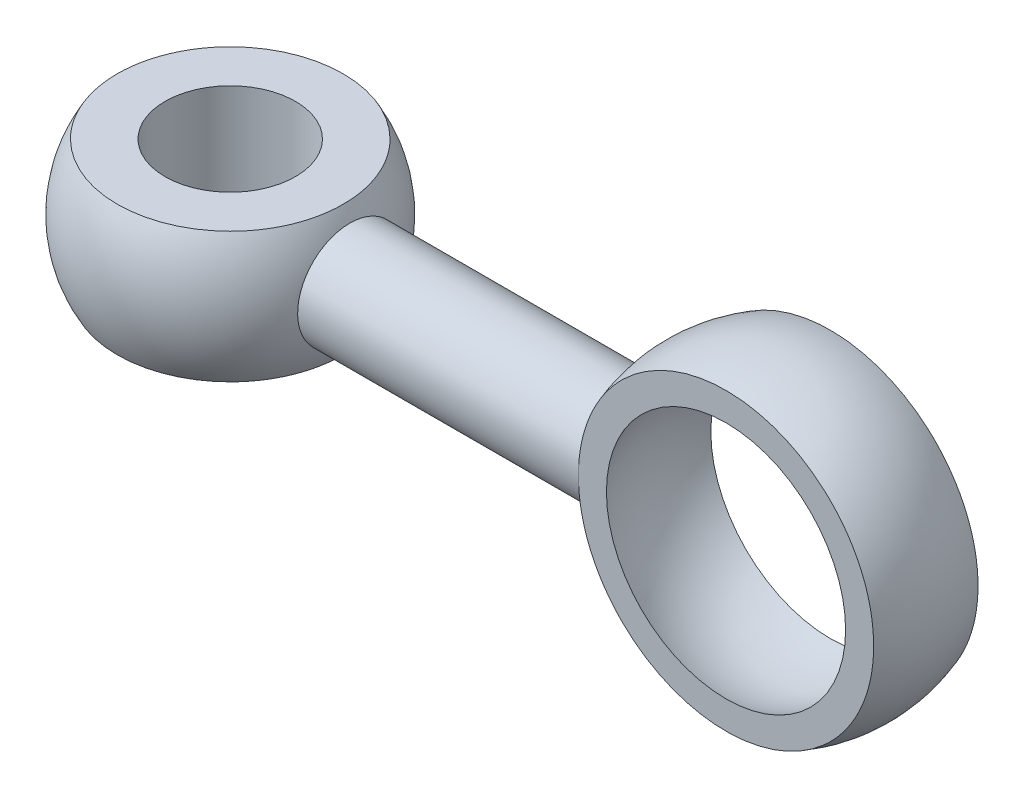
ISO-10303-21;
HEADER;
FILE_DESCRIPTION(('STEP AP214'),'2;1');
FILE_NAME('part.step','',(''),(''),'','','');
FILE_SCHEMA(('AUTOMOTIVE_DESIGN { 1 0 10303 214 1 1 1 1 }'));
ENDSEC;
DATA;
#1=APPLICATION_CONTEXT('core data for automotive mechanical design processes');
#2=APPLICATION_PROTOCOL_DEFINITION('international standard','automotive_design',2000,#1);
#3=PRODUCT_CONTEXT('',#1,'mechanical');
#4=PRODUCT('Part','Part','',(#3));
#5=PRODUCT_RELATED_PRODUCT_CATEGORY('part','',(#4));
#6=PRODUCT_DEFINITION_FORMATION('','',#4);
#7=PRODUCT_DEFINITION_CONTEXT('part definition',#1,'design');
#8=PRODUCT_DEFINITION('design','',#6,#7);
#9=PRODUCT_DEFINITION_SHAPE('','',#8);
#10=(LENGTH_UNIT() NAMED_UNIT(*) SI_UNIT(.MILLI.,.METRE.));
#11=(NAMED_UNIT(*) PLANE_ANGLE_UNIT() SI_UNIT($,.RADIAN.));
#12=(NAMED_UNIT(*) SI_UNIT($,.STERADIAN.) SOLID_ANGLE_UNIT());
#13=UNCERTAINTY_MEASURE_WITH_UNIT(LENGTH_MEASURE(1.E-05),#10,'distance_accuracy_value','');
#14=(GEOMETRIC_REPRESENTATION_CONTEXT(3) GLOBAL_UNCERTAINTY_ASSIGNED_CONTEXT((#13)) GLOBAL_UNIT_ASSIGNED_CONTEXT((#10,
#11,#12)) REPRESENTATION_CONTEXT('',''));
#15=CARTESIAN_POINT('',(0.,0.,0.));
#16=DIRECTION('',(0.,0.,1.));
#17=DIRECTION('',(1.,0.,0.));
#18=AXIS2_PLACEMENT_3D('',#15,#16,#17);
#19=CARTESIAN_POINT('',(0.,0.,0.));
#20=DIRECTION('',(1.,0.,0.));
#21=DIRECTION('',(0.,-1.,0.));
#22=AXIS2_PLACEMENT_3D('',#19,#20,#21);
#23=SPHERICAL_SURFACE('',#22,6.);
#24=CARTESIAN_POINT('',(-5.65685424949238,0.,0.));
#25=DIRECTION('',(1.,0.,0.));
#26=DIRECTION('',(0.,0.,-1.));
#27=AXIS2_PLACEMENT_3D('',#24,#25,#26);
#28=CIRCLE('',#27,2.);
#29=CARTESIAN_POINT('',(-5.65685424949238,0.,2.));
#30=VERTEX_POINT('',#29);
#31=CARTESIAN_POINT('',(-5.65685424949238,0.,-2.));
#32=VERTEX_POINT('',#31);
#33=EDGE_CURVE('E58',#30,#32,#28,.T.);
#34=ORIENTED_EDGE('',*,*,#33,.T.);
#35=CARTESIAN_POINT('',(0.,0.,-2.));
#36=DIRECTION('',(0.,0.,1.));
#37=DIRECTION('',(1.,0.,0.));
#38=AXIS2_PLACEMENT_3D('',#35,#36,#37);
#39=CIRCLE('',#38,5.65685424949238);
#40=EDGE_CURVE('E11',#32,#32,#39,.F.);
#41=ORIENTED_EDGE('',*,*,#40,.F.);
#42=EDGE_CURVE('E60',#32,#30,#28,.T.);
#43=ORIENTED_EDGE('',*,*,#42,.T.);
#44=CARTESIAN_POINT('',(0.,0.,2.));
#45=DIRECTION('',(0.,0.,-1.));
#46=DIRECTION('',(-1.,0.,0.));
#47=AXIS2_PLACEMENT_3D('',#44,#45,#46);
#48=CIRCLE('',#47,5.65685424949238);
#49=EDGE_CURVE('E48',#30,#30,#48,.F.);
#50=ORIENTED_EDGE('',*,*,#49,.F.);
#51=EDGE_LOOP('',(#34,#41,#43,#50));
#52=FACE_BOUND('',#51,.T.);
#53=ADVANCED_FACE('F39',(#52),#23,.T.);
#54=CARTESIAN_POINT('',(-21.,0.,0.));
#55=DIRECTION('',(1.,0.,0.));
#56=DIRECTION('',(0.,1.,0.));
#57=AXIS2_PLACEMENT_3D('',#54,#55,#56);
#58=SPHERICAL_SURFACE('',#57,5.);
#59=CARTESIAN_POINT('',(-21.,-2.5,0.));
#60=DIRECTION('',(0.,1.,0.));
#61=DIRECTION('',(0.,0.,1.));
#62=AXIS2_PLACEMENT_3D('',#59,#60,#61);
#63=CIRCLE('',#62,4.33012701892219);
#64=CARTESIAN_POINT('',(-21.,-2.5,4.33012701892219));
#65=VERTEX_POINT('',#64);
#66=EDGE_CURVE('E63',#65,#65,#63,.F.);
#67=ORIENTED_EDGE('',*,*,#66,.F.);
#68=EDGE_LOOP('',(#67));
#69=FACE_BOUND('',#68,.T.);
#70=CARTESIAN_POINT('',(-21.,2.5,0.));
#71=DIRECTION('',(0.,-1.,0.));
#72=DIRECTION('',(0.,0.,-1.));
#73=AXIS2_PLACEMENT_3D('',#70,#71,#72);
#74=CIRCLE('',#73,4.33012701892219);
#75=CARTESIAN_POINT('',(-21.,2.5,-4.33012701892219));
#76=VERTEX_POINT('',#75);
#77=EDGE_CURVE('E67',#76,#76,#74,.F.);
#78=ORIENTED_EDGE('',*,*,#77,.F.);
#79=EDGE_LOOP('',(#78));
#80=FACE_BOUND('',#79,.T.);
#81=CARTESIAN_POINT('',(-16.4174243050442,0.,0.));
#82=DIRECTION('',(1.,0.,0.));
#83=DIRECTION('',(0.,0.,-1.));
#84=AXIS2_PLACEMENT_3D('',#81,#82,#83);
#85=CIRCLE('',#84,2.);
#86=CARTESIAN_POINT('',(-16.4174243050442,0.,-2.));
#87=VERTEX_POINT('',#86);
#88=EDGE_CURVE('E78',#87,#87,#85,.T.);
#89=ORIENTED_EDGE('',*,*,#88,.F.);
#90=EDGE_LOOP('',(#89));
#91=FACE_BOUND('',#90,.T.);
#92=ADVANCED_FACE('F108',(#69,#80,#91),#58,.T.);
#93=CARTESIAN_POINT('',(6.21465699734194,0.,0.));
#94=DIRECTION('',(1.,0.,0.));
#95=DIRECTION('',(0.,0.,-1.));
#96=AXIS2_PLACEMENT_3D('',#93,#94,#95);
#97=CYLINDRICAL_SURFACE('',#96,2.);
#98=ORIENTED_EDGE('',*,*,#88,.T.);
#99=EDGE_LOOP('',(#98));
#100=FACE_BOUND('',#99,.T.);
#101=ORIENTED_EDGE('',*,*,#42,.F.);
#102=ORIENTED_EDGE('',*,*,#33,.F.);
#103=EDGE_LOOP('',(#101,#102));
#104=FACE_BOUND('',#103,.T.);
#105=ADVANCED_FACE('F112',(#100,#104),#97,.T.);
#106=CARTESIAN_POINT('',(-16.6698729810778,2.5,-5.));
#107=DIRECTION('',(0.,-1.,0.));
#108=DIRECTION('',(0.,0.,-1.));
#109=AXIS2_PLACEMENT_3D('',#106,#107,#108);
#110=PLANE('',#109);
#111=CARTESIAN_POINT('',(-21.,2.5,0.));
#112=DIRECTION('',(0.,1.,0.));
#113=DIRECTION('',(0.,0.,1.));
#114=AXIS2_PLACEMENT_3D('',#111,#112,#113);
#115=CIRCLE('',#114,2.5);
#116=CARTESIAN_POINT('',(-21.,2.5,2.5));
#117=VERTEX_POINT('',#116);
#118=EDGE_CURVE('E73',#117,#117,#115,.T.);
#119=ORIENTED_EDGE('',*,*,#118,.F.);
#120=EDGE_LOOP('',(#119));
#121=FACE_BOUND('',#120,.T.);
#122=ORIENTED_EDGE('',*,*,#77,.T.);
#123=EDGE_LOOP('',(#122));
#124=FACE_BOUND('',#123,.T.);
#125=ADVANCED_FACE('F117',(#121,#124),#110,.F.);
#126=CARTESIAN_POINT('',(-16.6698729810778,-2.5,-5.));
#127=DIRECTION('',(0.,1.,0.));
#128=DIRECTION('',(0.,0.,1.));
#129=AXIS2_PLACEMENT_3D('',#126,#127,#128);
#130=PLANE('',#129);
#131=CARTESIAN_POINT('',(-21.,-2.5,0.));
#132=DIRECTION('',(0.,1.,0.));
#133=DIRECTION('',(0.,0.,1.));
#134=AXIS2_PLACEMENT_3D('',#131,#132,#133);
#135=CIRCLE('',#134,2.5);
#136=CARTESIAN_POINT('',(-21.,-2.5,2.5));
#137=VERTEX_POINT('',#136);
#138=EDGE_CURVE('E70',#137,#137,#135,.T.);
#139=ORIENTED_EDGE('',*,*,#138,.T.);
#140=EDGE_LOOP('',(#139));
#141=FACE_BOUND('',#140,.T.);
#142=ORIENTED_EDGE('',*,*,#66,.T.);
#143=EDGE_LOOP('',(#142));
#144=FACE_BOUND('',#143,.T.);
#145=ADVANCED_FACE('F125',(#141,#144),#130,.F.);
#146=CARTESIAN_POINT('',(-21.,-7.5,0.));
#147=DIRECTION('',(0.,1.,0.));
#148=DIRECTION('',(0.,0.,1.));
#149=AXIS2_PLACEMENT_3D('',#146,#147,#148);
#150=CYLINDRICAL_SURFACE('',#149,2.5);
#151=ORIENTED_EDGE('',*,*,#118,.T.);
#152=EDGE_LOOP('',(#151));
#153=FACE_BOUND('',#152,.T.);
#154=ORIENTED_EDGE('',*,*,#138,.F.);
#155=EDGE_LOOP('',(#154));
#156=FACE_BOUND('',#155,.T.);
#157=ADVANCED_FACE('F129',(#153,#156),#150,.F.);
#158=CARTESIAN_POINT('',(-5.65685424949238,-6.,2.));
#159=DIRECTION('',(0.,0.,-1.));
#160=DIRECTION('',(-1.,0.,0.));
#161=AXIS2_PLACEMENT_3D('',#158,#159,#160);
#162=PLANE('',#161);
#163=CARTESIAN_POINT('',(0.,0.,2.));
#164=DIRECTION('',(0.,0.,-1.));
#165=DIRECTION('',(-1.,0.,0.));
#166=AXIS2_PLACEMENT_3D('',#163,#164,#165);
#167=CIRCLE('',#166,4.58257569495584);
#168=CARTESIAN_POINT('',(-4.58257569495584,0.,2.));
#169=VERTEX_POINT('',#168);
#170=EDGE_CURVE('E87',#169,#169,#167,.T.);
#171=ORIENTED_EDGE('',*,*,#170,.T.);
#172=EDGE_LOOP('',(#171));
#173=FACE_BOUND('',#172,.T.);
#174=ORIENTED_EDGE('',*,*,#49,.T.);
#175=EDGE_LOOP('',(#174));
#176=FACE_BOUND('',#175,.T.);
#177=ADVANCED_FACE('F105',(#173,#176),#162,.F.);
#178=CARTESIAN_POINT('',(-5.65685424949238,-6.,-2.00000000000001));
#179=DIRECTION('',(0.,0.,1.));
#180=DIRECTION('',(1.,0.,0.));
#181=AXIS2_PLACEMENT_3D('',#178,#179,#180);
#182=PLANE('',#181);
#183=CARTESIAN_POINT('',(0.,0.,-2.));
#184=DIRECTION('',(0.,0.,1.));
#185=DIRECTION('',(1.,0.,0.));
#186=AXIS2_PLACEMENT_3D('',#183,#184,#185);
#187=CIRCLE('',#186,4.58257569495584);
#188=CARTESIAN_POINT('',(4.58257569495584,0.,-2.));
#189=VERTEX_POINT('',#188);
#190=EDGE_CURVE('E42',#189,#189,#187,.T.);
#191=ORIENTED_EDGE('',*,*,#190,.T.);
#192=EDGE_LOOP('',(#191));
#193=FACE_BOUND('',#192,.T.);
#194=ORIENTED_EDGE('',*,*,#40,.T.);
#195=EDGE_LOOP('',(#194));
#196=FACE_BOUND('',#195,.T.);
#197=ADVANCED_FACE('F96',(#193,#196),#182,.F.);
#198=CARTESIAN_POINT('',(0.,0.,0.));
#199=DIRECTION('',(0.,1.,0.));
#200=DIRECTION('',(1.,0.,0.));
#201=AXIS2_PLACEMENT_3D('',#198,#199,#200);
#202=SPHERICAL_SURFACE('',#201,5.);
#203=CARTESIAN_POINT('',(0.,0.,0.));
#204=DIRECTION('',(0.,0.,1.));
#205=DIRECTION('',(1.,0.,0.));
#206=AXIS2_PLACEMENT_3D('',#203,#204,#205);
#207=SPHERICAL_SURFACE('',#206,5.);
#208=ORIENTED_EDGE('',*,*,#190,.F.);
#209=EDGE_LOOP('',(#208));
#210=FACE_BOUND('',#209,.T.);
#211=ORIENTED_EDGE('',*,*,#170,.F.);
#212=EDGE_LOOP('',(#211));
#213=FACE_BOUND('',#212,.T.);
#214=ADVANCED_FACE('F98',(#210,#213),#207,.F.);
#215=CLOSED_SHELL('',(#53,#92,#105,#125,#145,#157,#177,#197,#214));
#216=MANIFOLD_SOLID_BREP('B2',#215);
#217=ADVANCED_BREP_SHAPE_REPRESENTATION('',(#18,#216),#14);
#218=SHAPE_DEFINITION_REPRESENTATION(#9,#217);
ENDSEC;
END-ISO-10303-21;
